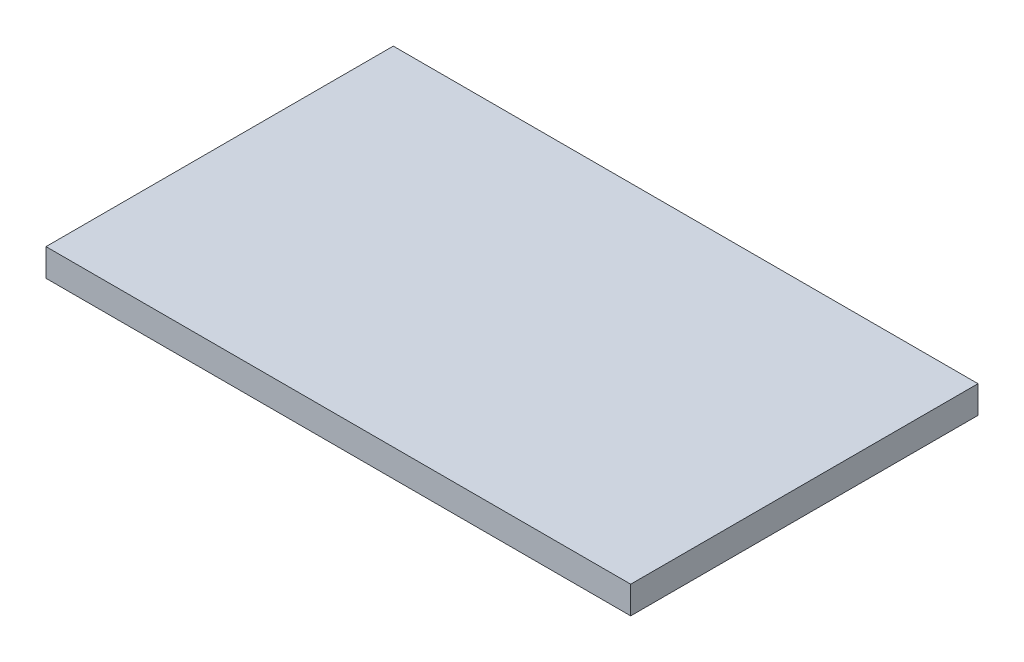
ISO-10303-21;
HEADER;
FILE_DESCRIPTION(('STEP AP214'),'2;1');
FILE_NAME('part.step','',(''),(''),'','','');
FILE_SCHEMA(('AUTOMOTIVE_DESIGN { 1 0 10303 214 1 1 1 1 }'));
ENDSEC;
DATA;
#1=APPLICATION_CONTEXT('core data for automotive mechanical design processes');
#2=APPLICATION_PROTOCOL_DEFINITION('international standard','automotive_design',2000,#1);
#3=PRODUCT_CONTEXT('',#1,'mechanical');
#4=PRODUCT('Part','Part','',(#3));
#5=PRODUCT_RELATED_PRODUCT_CATEGORY('part','',(#4));
#6=PRODUCT_DEFINITION_FORMATION('','',#4);
#7=PRODUCT_DEFINITION_CONTEXT('part definition',#1,'design');
#8=PRODUCT_DEFINITION('design','',#6,#7);
#9=PRODUCT_DEFINITION_SHAPE('','',#8);
#10=(LENGTH_UNIT() NAMED_UNIT(*) SI_UNIT(.MILLI.,.METRE.));
#11=(NAMED_UNIT(*) PLANE_ANGLE_UNIT() SI_UNIT($,.RADIAN.));
#12=(NAMED_UNIT(*) SI_UNIT($,.STERADIAN.) SOLID_ANGLE_UNIT());
#13=UNCERTAINTY_MEASURE_WITH_UNIT(LENGTH_MEASURE(1.E-05),#10,'distance_accuracy_value','');
#14=(GEOMETRIC_REPRESENTATION_CONTEXT(3) GLOBAL_UNCERTAINTY_ASSIGNED_CONTEXT((#13)) GLOBAL_UNIT_ASSIGNED_CONTEXT((#10,
#11,#12)) REPRESENTATION_CONTEXT('',''));
#15=CARTESIAN_POINT('',(0.,0.,0.));
#16=DIRECTION('',(0.,0.,1.));
#17=DIRECTION('',(1.,0.,0.));
#18=AXIS2_PLACEMENT_3D('',#15,#16,#17);
#19=CARTESIAN_POINT('',(61.5,121.5,-758.5));
#20=DIRECTION('',(-1.,0.,0.));
#21=DIRECTION('',(0.,0.,1.));
#22=AXIS2_PLACEMENT_3D('',#19,#20,#21);
#23=PLANE('',#22);
#24=DIRECTION('',(0.,-1.,0.));
#25=VECTOR('',#24,1.);
#26=CARTESIAN_POINT('',(61.5,121.5,0.));
#27=LINE('',#26,#25);
#28=CARTESIAN_POINT('',(61.5,181.5,0.));
#29=VERTEX_POINT('',#28);
#30=CARTESIAN_POINT('',(61.5,121.5,0.));
#31=VERTEX_POINT('',#30);
#32=EDGE_CURVE('E103',#29,#31,#27,.T.);
#33=ORIENTED_EDGE('',*,*,#32,.F.);
#34=DIRECTION('',(0.,0.,1.));
#35=VECTOR('',#34,1.);
#36=CARTESIAN_POINT('',(61.5,181.5,-758.5));
#37=LINE('',#36,#35);
#38=CARTESIAN_POINT('',(61.5,181.5,-758.5));
#39=VERTEX_POINT('',#38);
#40=EDGE_CURVE('E11',#39,#29,#37,.T.);
#41=ORIENTED_EDGE('',*,*,#40,.F.);
#42=DIRECTION('',(0.,-1.,0.));
#43=VECTOR('',#42,1.);
#44=CARTESIAN_POINT('',(61.5,121.5,-758.5));
#45=LINE('',#44,#43);
#46=CARTESIAN_POINT('',(61.5,121.5,-758.5));
#47=VERTEX_POINT('',#46);
#48=EDGE_CURVE('E97',#39,#47,#45,.T.);
#49=ORIENTED_EDGE('',*,*,#48,.T.);
#50=DIRECTION('',(0.,0.,1.));
#51=VECTOR('',#50,1.);
#52=CARTESIAN_POINT('',(61.5,121.5,-758.5));
#53=LINE('',#52,#51);
#54=EDGE_CURVE('E42',#47,#31,#53,.T.);
#55=ORIENTED_EDGE('',*,*,#54,.T.);
#56=EDGE_LOOP('',(#33,#41,#49,#55));
#57=FACE_BOUND('',#56,.T.);
#58=ADVANCED_FACE('F39',(#57),#23,.T.);
#59=CARTESIAN_POINT('',(61.5,181.5,-758.5));
#60=DIRECTION('',(0.,1.,0.));
#61=DIRECTION('',(0.,0.,1.));
#62=AXIS2_PLACEMENT_3D('',#59,#60,#61);
#63=PLANE('',#62);
#64=DIRECTION('',(-1.,0.,0.));
#65=VECTOR('',#64,1.);
#66=CARTESIAN_POINT('',(61.5,181.5,0.));
#67=LINE('',#66,#65);
#68=CARTESIAN_POINT('',(1338.5,181.5,0.));
#69=VERTEX_POINT('',#68);
#70=EDGE_CURVE('E99',#69,#29,#67,.T.);
#71=ORIENTED_EDGE('',*,*,#70,.F.);
#72=DIRECTION('',(0.,0.,1.));
#73=VECTOR('',#72,1.);
#74=CARTESIAN_POINT('',(1338.5,181.5,-758.5));
#75=LINE('',#74,#73);
#76=CARTESIAN_POINT('',(1338.5,181.5,-758.5));
#77=VERTEX_POINT('',#76);
#78=EDGE_CURVE('E48',#77,#69,#75,.T.);
#79=ORIENTED_EDGE('',*,*,#78,.F.);
#80=DIRECTION('',(-1.,0.,0.));
#81=VECTOR('',#80,1.);
#82=CARTESIAN_POINT('',(61.5,181.5,-758.5));
#83=LINE('',#82,#81);
#84=EDGE_CURVE('E94',#77,#39,#83,.T.);
#85=ORIENTED_EDGE('',*,*,#84,.T.);
#86=ORIENTED_EDGE('',*,*,#40,.T.);
#87=EDGE_LOOP('',(#71,#79,#85,#86));
#88=FACE_BOUND('',#87,.T.);
#89=ADVANCED_FACE('F113',(#88),#63,.T.);
#90=CARTESIAN_POINT('',(1338.5,121.5,-758.5));
#91=DIRECTION('',(1.,0.,0.));
#92=DIRECTION('',(0.,0.,-1.));
#93=AXIS2_PLACEMENT_3D('',#90,#91,#92);
#94=PLANE('',#93);
#95=DIRECTION('',(0.,1.,0.));
#96=VECTOR('',#95,1.);
#97=CARTESIAN_POINT('',(1338.5,121.5,0.));
#98=LINE('',#97,#96);
#99=CARTESIAN_POINT('',(1338.5,121.5,0.));
#100=VERTEX_POINT('',#99);
#101=EDGE_CURVE('E89',#100,#69,#98,.T.);
#102=ORIENTED_EDGE('',*,*,#101,.F.);
#103=DIRECTION('',(0.,0.,1.));
#104=VECTOR('',#103,1.);
#105=CARTESIAN_POINT('',(1338.5,121.5,-758.5));
#106=LINE('',#105,#104);
#107=CARTESIAN_POINT('',(1338.5,121.5,-758.5));
#108=VERTEX_POINT('',#107);
#109=EDGE_CURVE('E84',#108,#100,#106,.T.);
#110=ORIENTED_EDGE('',*,*,#109,.F.);
#111=DIRECTION('',(0.,1.,0.));
#112=VECTOR('',#111,1.);
#113=CARTESIAN_POINT('',(1338.5,121.5,-758.5));
#114=LINE('',#113,#112);
#115=EDGE_CURVE('E87',#108,#77,#114,.T.);
#116=ORIENTED_EDGE('',*,*,#115,.T.);
#117=ORIENTED_EDGE('',*,*,#78,.T.);
#118=EDGE_LOOP('',(#102,#110,#116,#117));
#119=FACE_BOUND('',#118,.T.);
#120=ADVANCED_FACE('F86',(#119),#94,.T.);
#121=CARTESIAN_POINT('',(61.5,121.5,-758.5));
#122=DIRECTION('',(0.,-1.,0.));
#123=DIRECTION('',(0.,0.,-1.));
#124=AXIS2_PLACEMENT_3D('',#121,#122,#123);
#125=PLANE('',#124);
#126=DIRECTION('',(1.,0.,0.));
#127=VECTOR('',#126,1.);
#128=CARTESIAN_POINT('',(61.5,121.5,0.));
#129=LINE('',#128,#127);
#130=EDGE_CURVE('E106',#31,#100,#129,.T.);
#131=ORIENTED_EDGE('',*,*,#130,.F.);
#132=ORIENTED_EDGE('',*,*,#54,.F.);
#133=DIRECTION('',(1.,0.,0.));
#134=VECTOR('',#133,1.);
#135=CARTESIAN_POINT('',(61.5,121.5,-758.5));
#136=LINE('',#135,#134);
#137=EDGE_CURVE('E93',#47,#108,#136,.T.);
#138=ORIENTED_EDGE('',*,*,#137,.T.);
#139=ORIENTED_EDGE('',*,*,#109,.T.);
#140=EDGE_LOOP('',(#131,#132,#138,#139));
#141=FACE_BOUND('',#140,.T.);
#142=ADVANCED_FACE('F96',(#141),#125,.T.);
#143=CARTESIAN_POINT('',(0.,0.,-758.5));
#144=DIRECTION('',(0.,0.,-1.));
#145=DIRECTION('',(-1.,0.,0.));
#146=AXIS2_PLACEMENT_3D('',#143,#144,#145);
#147=PLANE('',#146);
#148=ORIENTED_EDGE('',*,*,#48,.F.);
#149=ORIENTED_EDGE('',*,*,#84,.F.);
#150=ORIENTED_EDGE('',*,*,#115,.F.);
#151=ORIENTED_EDGE('',*,*,#137,.F.);
#152=EDGE_LOOP('',(#148,#149,#150,#151));
#153=FACE_BOUND('',#152,.T.);
#154=ADVANCED_FACE('F92',(#153),#147,.T.);
#155=CARTESIAN_POINT('',(0.,0.,0.));
#156=DIRECTION('',(0.,0.,-1.));
#157=DIRECTION('',(-1.,0.,0.));
#158=AXIS2_PLACEMENT_3D('',#155,#156,#157);
#159=PLANE('',#158);
#160=ORIENTED_EDGE('',*,*,#32,.T.);
#161=ORIENTED_EDGE('',*,*,#130,.T.);
#162=ORIENTED_EDGE('',*,*,#101,.T.);
#163=ORIENTED_EDGE('',*,*,#70,.T.);
#164=EDGE_LOOP('',(#160,#161,#162,#163));
#165=FACE_BOUND('',#164,.T.);
#166=ADVANCED_FACE('F112',(#165),#159,.F.);
#167=CLOSED_SHELL('',(#58,#89,#120,#142,#154,#166));
#168=MANIFOLD_SOLID_BREP('B2',#167);
#169=ADVANCED_BREP_SHAPE_REPRESENTATION('',(#18,#168),#14);
#170=SHAPE_DEFINITION_REPRESENTATION(#9,#169);
ENDSEC;
END-ISO-10303-21;
